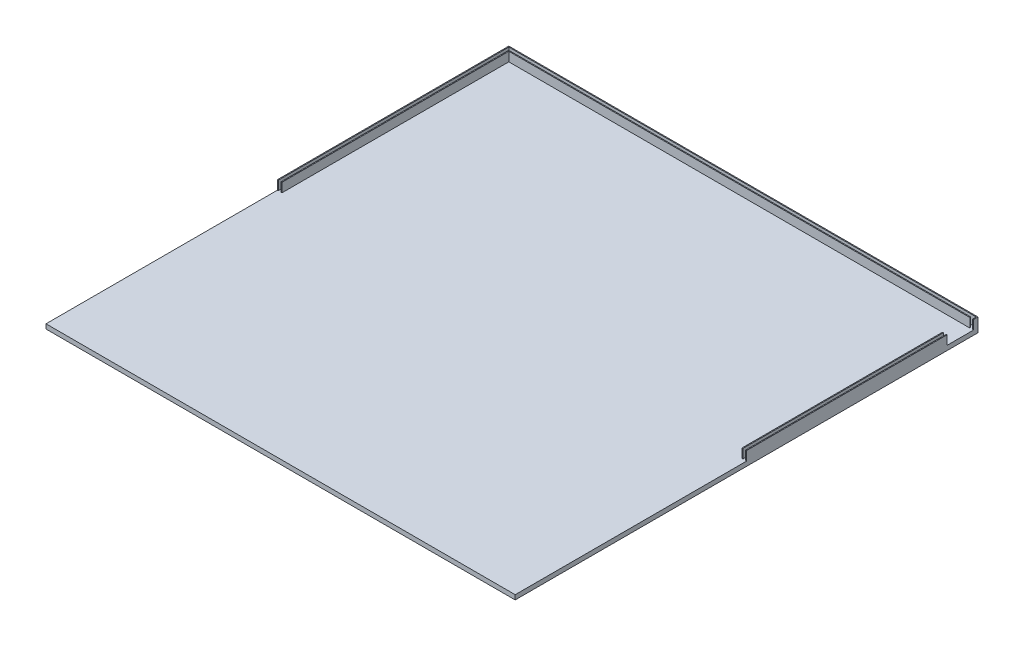
ISO-10303-21;
HEADER;
FILE_DESCRIPTION(('STEP AP214'),'2;1');
FILE_NAME('part.step','',(''),(''),'','','');
FILE_SCHEMA(('AUTOMOTIVE_DESIGN { 1 0 10303 214 1 1 1 1 }'));
ENDSEC;
DATA;
#1=APPLICATION_CONTEXT('core data for automotive mechanical design processes');
#2=APPLICATION_PROTOCOL_DEFINITION('international standard','automotive_design',2000,#1);
#3=PRODUCT_CONTEXT('',#1,'mechanical');
#4=PRODUCT('Part','Part','',(#3));
#5=PRODUCT_RELATED_PRODUCT_CATEGORY('part','',(#4));
#6=PRODUCT_DEFINITION_FORMATION('','',#4);
#7=PRODUCT_DEFINITION_CONTEXT('part definition',#1,'design');
#8=PRODUCT_DEFINITION('design','',#6,#7);
#9=PRODUCT_DEFINITION_SHAPE('','',#8);
#10=(LENGTH_UNIT() NAMED_UNIT(*) SI_UNIT(.MILLI.,.METRE.));
#11=(NAMED_UNIT(*) PLANE_ANGLE_UNIT() SI_UNIT($,.RADIAN.));
#12=(NAMED_UNIT(*) SI_UNIT($,.STERADIAN.) SOLID_ANGLE_UNIT());
#13=UNCERTAINTY_MEASURE_WITH_UNIT(LENGTH_MEASURE(1.E-05),#10,'distance_accuracy_value','');
#14=(GEOMETRIC_REPRESENTATION_CONTEXT(3) GLOBAL_UNCERTAINTY_ASSIGNED_CONTEXT((#13)) GLOBAL_UNIT_ASSIGNED_CONTEXT((#10,
#11,#12)) REPRESENTATION_CONTEXT('',''));
#15=CARTESIAN_POINT('',(0.,0.,0.));
#16=DIRECTION('',(0.,0.,1.));
#17=DIRECTION('',(1.,0.,0.));
#18=AXIS2_PLACEMENT_3D('',#15,#16,#17);
#19=CARTESIAN_POINT('',(0.,15.,0.));
#20=DIRECTION('',(0.,1.,0.));
#21=DIRECTION('',(0.,0.,1.));
#22=AXIS2_PLACEMENT_3D('',#19,#20,#21);
#23=PLANE('',#22);
#24=DIRECTION('',(-1.,0.,0.));
#25=VECTOR('',#24,1.);
#26=CARTESIAN_POINT('',(415.395426848687,15.,-66.0855947856733));
#27=LINE('',#26,#25);
#28=CARTESIAN_POINT('',(416.395426848687,15.,-66.0855947856733));
#29=VERTEX_POINT('',#28);
#30=CARTESIAN_POINT('',(415.395426848687,15.,-66.0855947856733));
#31=VERTEX_POINT('',#30);
#32=EDGE_CURVE('E206',#29,#31,#27,.T.);
#33=ORIENTED_EDGE('',*,*,#32,.F.);
#34=DIRECTION('',(0.,0.,-1.));
#35=VECTOR('',#34,1.);
#36=CARTESIAN_POINT('',(416.395426848687,15.,-71.0855947856733));
#37=LINE('',#36,#35);
#38=CARTESIAN_POINT('',(416.395426848687,15.,-71.0855947856733));
#39=VERTEX_POINT('',#38);
#40=EDGE_CURVE('E259',#29,#39,#37,.T.);
#41=ORIENTED_EDGE('',*,*,#40,.T.);
#42=DIRECTION('',(-1.,0.,0.));
#43=VECTOR('',#42,1.);
#44=CARTESIAN_POINT('',(-97.6045731513132,15.,-71.0855947856733));
#45=LINE('',#44,#43);
#46=CARTESIAN_POINT('',(-97.6045731513132,15.,-71.0855947856733));
#47=VERTEX_POINT('',#46);
#48=EDGE_CURVE('E286',#39,#47,#45,.T.);
#49=ORIENTED_EDGE('',*,*,#48,.T.);
#50=DIRECTION('',(0.,0.,1.));
#51=VECTOR('',#50,1.);
#52=CARTESIAN_POINT('',(-97.6045731513132,15.,-71.0855947856733));
#53=LINE('',#52,#51);
#54=CARTESIAN_POINT('',(-97.6045731513131,15.,182.414405214327));
#55=VERTEX_POINT('',#54);
#56=EDGE_CURVE('E276',#47,#55,#53,.T.);
#57=ORIENTED_EDGE('',*,*,#56,.T.);
#58=DIRECTION('',(1.,0.,0.));
#59=VECTOR('',#58,1.);
#60=CARTESIAN_POINT('',(-97.6045731513131,15.,182.414405214327));
#61=LINE('',#60,#59);
#62=CARTESIAN_POINT('',(-96.6045731513131,15.,182.414405214327));
#63=VERTEX_POINT('',#62);
#64=EDGE_CURVE('E280',#55,#63,#61,.T.);
#65=ORIENTED_EDGE('',*,*,#64,.T.);
#66=DIRECTION('',(0.,0.,1.));
#67=VECTOR('',#66,1.);
#68=CARTESIAN_POINT('',(-96.6045731513132,15.,-71.0855947856733));
#69=LINE('',#68,#67);
#70=CARTESIAN_POINT('',(-96.6045731513132,15.,-70.0855947856733));
#71=VERTEX_POINT('',#70);
#72=EDGE_CURVE('E245',#71,#63,#69,.T.);
#73=ORIENTED_EDGE('',*,*,#72,.F.);
#74=DIRECTION('',(-1.,0.,0.));
#75=VECTOR('',#74,1.);
#76=CARTESIAN_POINT('',(-96.6045731513132,15.,-70.0855947856733));
#77=LINE('',#76,#75);
#78=CARTESIAN_POINT('',(415.395426848687,15.,-70.0855947856733));
#79=VERTEX_POINT('',#78);
#80=EDGE_CURVE('E348',#79,#71,#77,.T.);
#81=ORIENTED_EDGE('',*,*,#80,.F.);
#82=DIRECTION('',(0.,0.,-1.));
#83=VECTOR('',#82,1.);
#84=CARTESIAN_POINT('',(415.395426848687,15.,-71.0855947856733));
#85=LINE('',#84,#83);
#86=EDGE_CURVE('E60',#31,#79,#85,.T.);
#87=ORIENTED_EDGE('',*,*,#86,.F.);
#88=EDGE_LOOP('',(#33,#41,#49,#57,#65,#73,#81,#87));
#89=FACE_BOUND('',#88,.T.);
#90=ADVANCED_FACE('F37',(#89),#23,.T.);
#91=CARTESIAN_POINT('',(415.395426848687,5.,-71.0855947856733));
#92=DIRECTION('',(1.,0.,0.));
#93=DIRECTION('',(0.,0.,-1.));
#94=AXIS2_PLACEMENT_3D('',#91,#92,#93);
#95=PLANE('',#94);
#96=DIRECTION('',(0.,0.,-1.));
#97=VECTOR('',#96,1.);
#98=CARTESIAN_POINT('',(415.395426848687,5.,-71.0855947856733));
#99=LINE('',#98,#97);
#100=CARTESIAN_POINT('',(415.395426848687,5.,-66.0855947856733));
#101=VERTEX_POINT('',#100);
#102=CARTESIAN_POINT('',(415.395426848687,5.,-70.0855947856733));
#103=VERTEX_POINT('',#102);
#104=EDGE_CURVE('E222',#101,#103,#99,.T.);
#105=ORIENTED_EDGE('',*,*,#104,.F.);
#106=DIRECTION('',(0.,1.,0.));
#107=VECTOR('',#106,1.);
#108=CARTESIAN_POINT('',(415.395426848687,5.,-66.0855947856733));
#109=LINE('',#108,#107);
#110=EDGE_CURVE('E382',#101,#31,#109,.T.);
#111=ORIENTED_EDGE('',*,*,#110,.T.);
#112=ORIENTED_EDGE('',*,*,#86,.T.);
#113=DIRECTION('',(0.,1.,0.));
#114=VECTOR('',#113,1.);
#115=CARTESIAN_POINT('',(415.395426848687,5.,-70.0855947856733));
#116=LINE('',#115,#114);
#117=EDGE_CURVE('E340',#103,#79,#116,.T.);
#118=ORIENTED_EDGE('',*,*,#117,.F.);
#119=EDGE_LOOP('',(#105,#111,#112,#118));
#120=FACE_BOUND('',#119,.T.);
#121=ADVANCED_FACE('F428',(#120),#95,.F.);
#122=CARTESIAN_POINT('',(412.395426848687,5.,-71.0855947856733));
#123=DIRECTION('',(-1.,0.,0.));
#124=DIRECTION('',(0.,0.,1.));
#125=AXIS2_PLACEMENT_3D('',#122,#123,#124);
#126=PLANE('',#125);
#127=DIRECTION('',(0.,0.,1.));
#128=VECTOR('',#127,1.);
#129=CARTESIAN_POINT('',(412.395426848687,15.,-71.0855947856733));
#130=LINE('',#129,#128);
#131=CARTESIAN_POINT('',(412.395426848687,15.,-67.0855947856733));
#132=VERTEX_POINT('',#131);
#133=CARTESIAN_POINT('',(412.395426848687,15.,-66.0855947856733));
#134=VERTEX_POINT('',#133);
#135=EDGE_CURVE('E226',#132,#134,#130,.T.);
#136=ORIENTED_EDGE('',*,*,#135,.T.);
#137=DIRECTION('',(0.,1.,0.));
#138=VECTOR('',#137,1.);
#139=CARTESIAN_POINT('',(412.395426848687,5.,-66.0855947856733));
#140=LINE('',#139,#138);
#141=CARTESIAN_POINT('',(412.395426848687,5.,-66.0855947856733));
#142=VERTEX_POINT('',#141);
#143=EDGE_CURVE('E372',#142,#134,#140,.T.);
#144=ORIENTED_EDGE('',*,*,#143,.F.);
#145=DIRECTION('',(0.,0.,1.));
#146=VECTOR('',#145,1.);
#147=CARTESIAN_POINT('',(412.395426848687,5.,-71.0855947856733));
#148=LINE('',#147,#146);
#149=CARTESIAN_POINT('',(412.395426848687,5.,-67.0855947856733));
#150=VERTEX_POINT('',#149);
#151=EDGE_CURVE('E224',#150,#142,#148,.T.);
#152=ORIENTED_EDGE('',*,*,#151,.F.);
#153=DIRECTION('',(0.,1.,0.));
#154=VECTOR('',#153,1.);
#155=CARTESIAN_POINT('',(412.395426848687,5.,-67.0855947856733));
#156=LINE('',#155,#154);
#157=EDGE_CURVE('E351',#150,#132,#156,.T.);
#158=ORIENTED_EDGE('',*,*,#157,.T.);
#159=EDGE_LOOP('',(#136,#144,#152,#158));
#160=FACE_BOUND('',#159,.T.);
#161=ADVANCED_FACE('F482',(#160),#126,.F.);
#162=DIRECTION('',(1.,0.,0.));
#163=VECTOR('',#162,1.);
#164=CARTESIAN_POINT('',(-97.6045731513132,15.,-66.0855947856733));
#165=LINE('',#164,#163);
#166=CARTESIAN_POINT('',(-92.6045731513131,15.,-66.0855947856733));
#167=VERTEX_POINT('',#166);
#168=EDGE_CURVE('E336',#167,#134,#165,.T.);
#169=ORIENTED_EDGE('',*,*,#168,.T.);
#170=ORIENTED_EDGE('',*,*,#135,.F.);
#171=DIRECTION('',(1.,0.,0.));
#172=VECTOR('',#171,1.);
#173=CARTESIAN_POINT('',(-96.6045731513132,15.,-67.0855947856733));
#174=LINE('',#173,#172);
#175=CARTESIAN_POINT('',(-93.6045731513131,15.,-67.0855947856733));
#176=VERTEX_POINT('',#175);
#177=EDGE_CURVE('E345',#176,#132,#174,.T.);
#178=ORIENTED_EDGE('',*,*,#177,.F.);
#179=DIRECTION('',(0.,0.,-1.));
#180=VECTOR('',#179,1.);
#181=CARTESIAN_POINT('',(-93.6045731513131,15.,-71.0855947856733));
#182=LINE('',#181,#180);
#183=CARTESIAN_POINT('',(-93.6045731513131,15.,182.414405214327));
#184=VERTEX_POINT('',#183);
#185=EDGE_CURVE('E239',#184,#176,#182,.T.);
#186=ORIENTED_EDGE('',*,*,#185,.F.);
#187=CARTESIAN_POINT('',(-92.6045731513131,15.,182.414405214327));
#188=VERTEX_POINT('',#187);
#189=EDGE_CURVE('E278',#184,#188,#61,.T.);
#190=ORIENTED_EDGE('',*,*,#189,.T.);
#191=DIRECTION('',(0.,0.,-1.));
#192=VECTOR('',#191,1.);
#193=CARTESIAN_POINT('',(-92.6045731513131,15.,-71.0855947856733));
#194=LINE('',#193,#192);
#195=EDGE_CURVE('E283',#188,#167,#194,.T.);
#196=ORIENTED_EDGE('',*,*,#195,.T.);
#197=EDGE_LOOP('',(#169,#170,#178,#186,#190,#196));
#198=FACE_BOUND('',#197,.T.);
#199=ADVANCED_FACE('F467',(#198),#23,.T.);
#200=CARTESIAN_POINT('',(0.,0.,0.));
#201=DIRECTION('',(0.,1.,0.));
#202=DIRECTION('',(0.,0.,1.));
#203=AXIS2_PLACEMENT_3D('',#200,#201,#202);
#204=PLANE('',#203);
#205=CARTESIAN_POINT('',(366.395426848687,0.,-21.0855947856733));
#206=DIRECTION('',(0.,1.,0.));
#207=DIRECTION('',(0.,0.,1.));
#208=AXIS2_PLACEMENT_3D('',#205,#206,#207);
#209=CIRCLE('',#208,15.);
#210=CARTESIAN_POINT('',(366.395426848687,0.,-6.08559478567331));
#211=VERTEX_POINT('',#210);
#212=EDGE_CURVE('E45',#211,#211,#209,.F.);
#213=ORIENTED_EDGE('',*,*,#212,.F.);
#214=EDGE_LOOP('',(#213));
#215=FACE_BOUND('',#214,.T.);
#216=CARTESIAN_POINT('',(-47.6045731513132,0.,385.914405214327));
#217=DIRECTION('',(0.,1.,0.));
#218=DIRECTION('',(0.,0.,1.));
#219=AXIS2_PLACEMENT_3D('',#216,#217,#218);
#220=CIRCLE('',#219,15.);
#221=CARTESIAN_POINT('',(-47.6045731513132,0.,400.914405214327));
#222=VERTEX_POINT('',#221);
#223=EDGE_CURVE('E301',#222,#222,#220,.F.);
#224=ORIENTED_EDGE('',*,*,#223,.F.);
#225=EDGE_LOOP('',(#224));
#226=FACE_BOUND('',#225,.T.);
#227=DIRECTION('',(0.,0.,-1.));
#228=VECTOR('',#227,1.);
#229=CARTESIAN_POINT('',(416.395426848687,0.,-71.0855947856733));
#230=LINE('',#229,#228);
#231=CARTESIAN_POINT('',(416.395426848687,0.,435.914405214327));
#232=VERTEX_POINT('',#231);
#233=CARTESIAN_POINT('',(416.395426848687,0.,-71.0855947856733));
#234=VERTEX_POINT('',#233);
#235=EDGE_CURVE('E309',#232,#234,#230,.T.);
#236=ORIENTED_EDGE('',*,*,#235,.F.);
#237=DIRECTION('',(1.,0.,0.));
#238=VECTOR('',#237,1.);
#239=CARTESIAN_POINT('',(-97.6045731513131,0.,435.914405214327));
#240=LINE('',#239,#238);
#241=CARTESIAN_POINT('',(-97.6045731513131,0.,435.914405214327));
#242=VERTEX_POINT('',#241);
#243=EDGE_CURVE('E437',#242,#232,#240,.T.);
#244=ORIENTED_EDGE('',*,*,#243,.F.);
#245=DIRECTION('',(0.,0.,1.));
#246=VECTOR('',#245,1.);
#247=CARTESIAN_POINT('',(-97.6045731513132,0.,-71.0855947856733));
#248=LINE('',#247,#246);
#249=CARTESIAN_POINT('',(-97.6045731513132,0.,-71.0855947856733));
#250=VERTEX_POINT('',#249);
#251=EDGE_CURVE('E443',#250,#242,#248,.T.);
#252=ORIENTED_EDGE('',*,*,#251,.F.);
#253=DIRECTION('',(-1.,0.,0.));
#254=VECTOR('',#253,1.);
#255=CARTESIAN_POINT('',(-97.6045731513132,0.,-71.0855947856733));
#256=LINE('',#255,#254);
#257=EDGE_CURVE('E315',#234,#250,#256,.T.);
#258=ORIENTED_EDGE('',*,*,#257,.F.);
#259=EDGE_LOOP('',(#236,#244,#252,#258));
#260=FACE_BOUND('',#259,.T.);
#261=CARTESIAN_POINT('',(366.395426848687,0.,385.914405214327));
#262=DIRECTION('',(0.,1.,0.));
#263=DIRECTION('',(0.,0.,1.));
#264=AXIS2_PLACEMENT_3D('',#261,#262,#263);
#265=CIRCLE('',#264,15.);
#266=CARTESIAN_POINT('',(366.395426848687,0.,400.914405214327));
#267=VERTEX_POINT('',#266);
#268=EDGE_CURVE('E889',#267,#267,#265,.F.);
#269=ORIENTED_EDGE('',*,*,#268,.F.);
#270=EDGE_LOOP('',(#269));
#271=FACE_BOUND('',#270,.T.);
#272=CARTESIAN_POINT('',(-47.6045731513131,0.,-21.0855947856733));
#273=DIRECTION('',(0.,1.,0.));
#274=DIRECTION('',(0.,0.,1.));
#275=AXIS2_PLACEMENT_3D('',#272,#273,#274);
#276=CIRCLE('',#275,15.);
#277=CARTESIAN_POINT('',(-47.6045731513131,0.,-6.08559478567333));
#278=VERTEX_POINT('',#277);
#279=EDGE_CURVE('E11',#278,#278,#276,.F.);
#280=ORIENTED_EDGE('',*,*,#279,.F.);
#281=EDGE_LOOP('',(#280));
#282=FACE_BOUND('',#281,.T.);
#283=ADVANCED_FACE('F454',(#215,#226,#260,#271,#282),#204,.F.);
#284=DIRECTION('',(1.,0.,0.));
#285=VECTOR('',#284,1.);
#286=CARTESIAN_POINT('',(415.395426848687,15.,-37.0855947856733));
#287=LINE('',#286,#285);
#288=CARTESIAN_POINT('',(415.395426848687,15.,-37.0855947856733));
#289=VERTEX_POINT('',#288);
#290=CARTESIAN_POINT('',(416.395426848687,15.,-37.0855947856733));
#291=VERTEX_POINT('',#290);
#292=EDGE_CURVE('E390',#289,#291,#287,.T.);
#293=ORIENTED_EDGE('',*,*,#292,.F.);
#294=CARTESIAN_POINT('',(415.395426848687,15.,182.414405214327));
#295=VERTEX_POINT('',#294);
#296=EDGE_CURVE('E214',#295,#289,#85,.T.);
#297=ORIENTED_EDGE('',*,*,#296,.F.);
#298=DIRECTION('',(1.,0.,0.));
#299=VECTOR('',#298,1.);
#300=CARTESIAN_POINT('',(416.395426848687,15.,182.414405214327));
#301=LINE('',#300,#299);
#302=CARTESIAN_POINT('',(416.395426848687,15.,182.414405214327));
#303=VERTEX_POINT('',#302);
#304=EDGE_CURVE('E261',#295,#303,#301,.T.);
#305=ORIENTED_EDGE('',*,*,#304,.T.);
#306=EDGE_CURVE('E255',#303,#291,#37,.T.);
#307=ORIENTED_EDGE('',*,*,#306,.T.);
#308=EDGE_LOOP('',(#293,#297,#305,#307));
#309=FACE_BOUND('',#308,.T.);
#310=ADVANCED_FACE('F463',(#309),#23,.T.);
#311=CARTESIAN_POINT('',(0.,5.,0.));
#312=DIRECTION('',(0.,1.,0.));
#313=DIRECTION('',(0.,0.,1.));
#314=AXIS2_PLACEMENT_3D('',#311,#312,#313);
#315=PLANE('',#314);
#316=DIRECTION('',(0.,0.,1.));
#317=VECTOR('',#316,1.);
#318=CARTESIAN_POINT('',(411.395426848687,5.,-71.0855947856733));
#319=LINE('',#318,#317);
#320=CARTESIAN_POINT('',(411.395426848687,5.,-37.0855947856733));
#321=VERTEX_POINT('',#320);
#322=CARTESIAN_POINT('',(411.395426848687,5.,182.414405214327));
#323=VERTEX_POINT('',#322);
#324=EDGE_CURVE('E252',#321,#323,#319,.T.);
#325=ORIENTED_EDGE('',*,*,#324,.F.);
#326=DIRECTION('',(1.,0.,0.));
#327=VECTOR('',#326,1.);
#328=CARTESIAN_POINT('',(411.395426848687,5.,-37.0855947856733));
#329=LINE('',#328,#327);
#330=CARTESIAN_POINT('',(412.395426848687,5.,-37.0855947856733));
#331=VERTEX_POINT('',#330);
#332=EDGE_CURVE('E376',#321,#331,#329,.T.);
#333=ORIENTED_EDGE('',*,*,#332,.T.);
#334=CARTESIAN_POINT('',(412.395426848687,5.,182.414405214327));
#335=VERTEX_POINT('',#334);
#336=EDGE_CURVE('E221',#331,#335,#148,.T.);
#337=ORIENTED_EDGE('',*,*,#336,.T.);
#338=DIRECTION('',(1.,0.,0.));
#339=VECTOR('',#338,1.);
#340=CARTESIAN_POINT('',(416.395426848687,5.,182.414405214327));
#341=LINE('',#340,#339);
#342=EDGE_CURVE('E267',#323,#335,#341,.T.);
#343=ORIENTED_EDGE('',*,*,#342,.F.);
#344=EDGE_LOOP('',(#325,#333,#337,#343));
#345=FACE_BOUND('',#344,.T.);
#346=DIRECTION('',(0.,0.,-1.));
#347=VECTOR('',#346,1.);
#348=CARTESIAN_POINT('',(-93.6045731513131,5.,-71.0855947856733));
#349=LINE('',#348,#347);
#350=CARTESIAN_POINT('',(-93.6045731513131,5.,182.414405214327));
#351=VERTEX_POINT('',#350);
#352=CARTESIAN_POINT('',(-93.6045731513131,5.,-67.0855947856733));
#353=VERTEX_POINT('',#352);
#354=EDGE_CURVE('E242',#351,#353,#349,.T.);
#355=ORIENTED_EDGE('',*,*,#354,.T.);
#356=DIRECTION('',(1.,0.,0.));
#357=VECTOR('',#356,1.);
#358=CARTESIAN_POINT('',(-96.6045731513132,5.,-67.0855947856733));
#359=LINE('',#358,#357);
#360=EDGE_CURVE('E343',#353,#150,#359,.T.);
#361=ORIENTED_EDGE('',*,*,#360,.T.);
#362=ORIENTED_EDGE('',*,*,#151,.T.);
#363=DIRECTION('',(1.,0.,0.));
#364=VECTOR('',#363,1.);
#365=CARTESIAN_POINT('',(-97.6045731513132,5.,-66.0855947856733));
#366=LINE('',#365,#364);
#367=CARTESIAN_POINT('',(-92.6045731513131,5.,-66.0855947856733));
#368=VERTEX_POINT('',#367);
#369=EDGE_CURVE('E331',#368,#142,#366,.T.);
#370=ORIENTED_EDGE('',*,*,#369,.F.);
#371=DIRECTION('',(0.,0.,-1.));
#372=VECTOR('',#371,1.);
#373=CARTESIAN_POINT('',(-92.6045731513131,5.,-71.0855947856733));
#374=LINE('',#373,#372);
#375=CARTESIAN_POINT('',(-92.6045731513131,5.,182.414405214327));
#376=VERTEX_POINT('',#375);
#377=EDGE_CURVE('E279',#376,#368,#374,.T.);
#378=ORIENTED_EDGE('',*,*,#377,.F.);
#379=DIRECTION('',(1.,0.,0.));
#380=VECTOR('',#379,1.);
#381=CARTESIAN_POINT('',(-97.6045731513131,5.,182.414405214327));
#382=LINE('',#381,#380);
#383=EDGE_CURVE('E275',#351,#376,#382,.T.);
#384=ORIENTED_EDGE('',*,*,#383,.F.);
#385=EDGE_LOOP('',(#355,#361,#362,#370,#378,#384));
#386=FACE_BOUND('',#385,.T.);
#387=CARTESIAN_POINT('',(415.395426848687,5.,182.414405214327));
#388=VERTEX_POINT('',#387);
#389=CARTESIAN_POINT('',(415.395426848687,5.,-37.0855947856733));
#390=VERTEX_POINT('',#389);
#391=EDGE_CURVE('E211',#388,#390,#99,.T.);
#392=ORIENTED_EDGE('',*,*,#391,.T.);
#393=DIRECTION('',(1.,0.,0.));
#394=VECTOR('',#393,1.);
#395=CARTESIAN_POINT('',(415.395426848687,5.,-37.0855947856733));
#396=LINE('',#395,#394);
#397=CARTESIAN_POINT('',(416.395426848687,5.,-37.0855947856733));
#398=VERTEX_POINT('',#397);
#399=EDGE_CURVE('E52',#390,#398,#396,.T.);
#400=ORIENTED_EDGE('',*,*,#399,.T.);
#401=DIRECTION('',(0.,0.,-1.));
#402=VECTOR('',#401,1.);
#403=CARTESIAN_POINT('',(416.395426848687,5.,-37.0855947856733));
#404=LINE('',#403,#402);
#405=CARTESIAN_POINT('',(416.395426848687,5.,-66.0855947856733));
#406=VERTEX_POINT('',#405);
#407=EDGE_CURVE('E205',#398,#406,#404,.T.);
#408=ORIENTED_EDGE('',*,*,#407,.T.);
#409=DIRECTION('',(-1.,0.,0.));
#410=VECTOR('',#409,1.);
#411=CARTESIAN_POINT('',(415.395426848687,5.,-66.0855947856733));
#412=LINE('',#411,#410);
#413=EDGE_CURVE('E215',#406,#101,#412,.T.);
#414=ORIENTED_EDGE('',*,*,#413,.T.);
#415=ORIENTED_EDGE('',*,*,#104,.T.);
#416=DIRECTION('',(-1.,0.,0.));
#417=VECTOR('',#416,1.);
#418=CARTESIAN_POINT('',(-96.6045731513132,5.,-70.0855947856733));
#419=LINE('',#418,#417);
#420=CARTESIAN_POINT('',(-96.6045731513132,5.,-70.0855947856733));
#421=VERTEX_POINT('',#420);
#422=EDGE_CURVE('E347',#103,#421,#419,.T.);
#423=ORIENTED_EDGE('',*,*,#422,.T.);
#424=DIRECTION('',(0.,0.,1.));
#425=VECTOR('',#424,1.);
#426=CARTESIAN_POINT('',(-96.6045731513132,5.,-71.0855947856733));
#427=LINE('',#426,#425);
#428=CARTESIAN_POINT('',(-96.6045731513131,5.,182.414405214327));
#429=VERTEX_POINT('',#428);
#430=EDGE_CURVE('E244',#421,#429,#427,.T.);
#431=ORIENTED_EDGE('',*,*,#430,.T.);
#432=CARTESIAN_POINT('',(-97.6045731513131,5.,182.414405214327));
#433=VERTEX_POINT('',#432);
#434=EDGE_CURVE('E296',#433,#429,#382,.T.);
#435=ORIENTED_EDGE('',*,*,#434,.F.);
#436=DIRECTION('',(0.,0.,1.));
#437=VECTOR('',#436,1.);
#438=CARTESIAN_POINT('',(-97.6045731513132,5.,-71.0855947856733));
#439=LINE('',#438,#437);
#440=CARTESIAN_POINT('',(-97.6045731513131,5.,435.914405214327));
#441=VERTEX_POINT('',#440);
#442=EDGE_CURVE('E429',#433,#441,#439,.T.);
#443=ORIENTED_EDGE('',*,*,#442,.T.);
#444=DIRECTION('',(1.,0.,0.));
#445=VECTOR('',#444,1.);
#446=CARTESIAN_POINT('',(-97.6045731513131,5.,435.914405214327));
#447=LINE('',#446,#445);
#448=CARTESIAN_POINT('',(416.395426848687,5.,435.914405214327));
#449=VERTEX_POINT('',#448);
#450=EDGE_CURVE('E433',#441,#449,#447,.T.);
#451=ORIENTED_EDGE('',*,*,#450,.T.);
#452=DIRECTION('',(0.,0.,-1.));
#453=VECTOR('',#452,1.);
#454=CARTESIAN_POINT('',(416.395426848687,5.,-71.0855947856733));
#455=LINE('',#454,#453);
#456=CARTESIAN_POINT('',(416.395426848687,5.,182.414405214327));
#457=VERTEX_POINT('',#456);
#458=EDGE_CURVE('E434',#449,#457,#455,.T.);
#459=ORIENTED_EDGE('',*,*,#458,.T.);
#460=EDGE_CURVE('E220',#388,#457,#341,.T.);
#461=ORIENTED_EDGE('',*,*,#460,.F.);
#462=EDGE_LOOP('',(#392,#400,#408,#414,#415,#423,#431,#435,#443,#451,#459,#461));
#463=FACE_BOUND('',#462,.T.);
#464=ADVANCED_FACE('F218',(#345,#386,#463),#315,.T.);
#465=CARTESIAN_POINT('',(-92.6045731513131,15.,-71.0855947856733));
#466=DIRECTION('',(-1.,0.,0.));
#467=DIRECTION('',(0.,0.,1.));
#468=AXIS2_PLACEMENT_3D('',#465,#466,#467);
#469=PLANE('',#468);
#470=DIRECTION('',(0.,-1.,0.));
#471=VECTOR('',#470,1.);
#472=CARTESIAN_POINT('',(-92.6045731513131,15.,-66.0855947856733));
#473=LINE('',#472,#471);
#474=EDGE_CURVE('E228',#167,#368,#473,.T.);
#475=ORIENTED_EDGE('',*,*,#474,.F.);
#476=ORIENTED_EDGE('',*,*,#195,.F.);
#477=DIRECTION('',(0.,-1.,0.));
#478=VECTOR('',#477,1.);
#479=CARTESIAN_POINT('',(-92.6045731513131,15.,182.414405214327));
#480=LINE('',#479,#478);
#481=EDGE_CURVE('E288',#188,#376,#480,.T.);
#482=ORIENTED_EDGE('',*,*,#481,.T.);
#483=ORIENTED_EDGE('',*,*,#377,.T.);
#484=EDGE_LOOP('',(#475,#476,#482,#483));
#485=FACE_BOUND('',#484,.T.);
#486=ADVANCED_FACE('F322',(#485),#469,.F.);
#487=CARTESIAN_POINT('',(411.395426848687,15.,-71.0855947856733));
#488=DIRECTION('',(1.,0.,0.));
#489=DIRECTION('',(0.,0.,-1.));
#490=AXIS2_PLACEMENT_3D('',#487,#488,#489);
#491=PLANE('',#490);
#492=DIRECTION('',(0.,0.,1.));
#493=VECTOR('',#492,1.);
#494=CARTESIAN_POINT('',(411.395426848687,15.,-71.0855947856733));
#495=LINE('',#494,#493);
#496=CARTESIAN_POINT('',(411.395426848687,15.,-37.0855947856733));
#497=VERTEX_POINT('',#496);
#498=CARTESIAN_POINT('',(411.395426848687,15.,182.414405214327));
#499=VERTEX_POINT('',#498);
#500=EDGE_CURVE('E258',#497,#499,#495,.T.);
#501=ORIENTED_EDGE('',*,*,#500,.F.);
#502=DIRECTION('',(0.,1.,0.));
#503=VECTOR('',#502,1.);
#504=CARTESIAN_POINT('',(411.395426848687,5.,-37.0855947856733));
#505=LINE('',#504,#503);
#506=EDGE_CURVE('E373',#321,#497,#505,.T.);
#507=ORIENTED_EDGE('',*,*,#506,.F.);
#508=ORIENTED_EDGE('',*,*,#324,.T.);
#509=DIRECTION('',(0.,-1.,0.));
#510=VECTOR('',#509,1.);
#511=CARTESIAN_POINT('',(411.395426848687,15.,182.414405214327));
#512=LINE('',#511,#510);
#513=EDGE_CURVE('E272',#499,#323,#512,.T.);
#514=ORIENTED_EDGE('',*,*,#513,.F.);
#515=EDGE_LOOP('',(#501,#507,#508,#514));
#516=FACE_BOUND('',#515,.T.);
#517=ADVANCED_FACE('F506',(#516),#491,.F.);
#518=CARTESIAN_POINT('',(-93.6045731513131,5.,-71.0855947856733));
#519=DIRECTION('',(1.,0.,0.));
#520=DIRECTION('',(0.,0.,-1.));
#521=AXIS2_PLACEMENT_3D('',#518,#519,#520);
#522=PLANE('',#521);
#523=ORIENTED_EDGE('',*,*,#185,.T.);
#524=DIRECTION('',(0.,1.,0.));
#525=VECTOR('',#524,1.);
#526=CARTESIAN_POINT('',(-93.6045731513131,5.,-67.0855947856733));
#527=LINE('',#526,#525);
#528=EDGE_CURVE('E357',#353,#176,#527,.T.);
#529=ORIENTED_EDGE('',*,*,#528,.F.);
#530=ORIENTED_EDGE('',*,*,#354,.F.);
#531=DIRECTION('',(0.,1.,0.));
#532=VECTOR('',#531,1.);
#533=CARTESIAN_POINT('',(-93.6045731513131,5.,182.414405214327));
#534=LINE('',#533,#532);
#535=EDGE_CURVE('E250',#351,#184,#534,.T.);
#536=ORIENTED_EDGE('',*,*,#535,.T.);
#537=EDGE_LOOP('',(#523,#529,#530,#536));
#538=FACE_BOUND('',#537,.T.);
#539=ADVANCED_FACE('F502',(#538),#522,.F.);
#540=CARTESIAN_POINT('',(-96.6045731513132,5.,-71.0855947856733));
#541=DIRECTION('',(-1.,0.,0.));
#542=DIRECTION('',(0.,0.,1.));
#543=AXIS2_PLACEMENT_3D('',#540,#541,#542);
#544=PLANE('',#543);
#545=ORIENTED_EDGE('',*,*,#430,.F.);
#546=DIRECTION('',(0.,1.,0.));
#547=VECTOR('',#546,1.);
#548=CARTESIAN_POINT('',(-96.6045731513132,5.,-70.0855947856733));
#549=LINE('',#548,#547);
#550=EDGE_CURVE('E337',#421,#71,#549,.T.);
#551=ORIENTED_EDGE('',*,*,#550,.T.);
#552=ORIENTED_EDGE('',*,*,#72,.T.);
#553=DIRECTION('',(0.,1.,0.));
#554=VECTOR('',#553,1.);
#555=CARTESIAN_POINT('',(-96.6045731513131,5.,182.414405214327));
#556=LINE('',#555,#554);
#557=EDGE_CURVE('E247',#429,#63,#556,.T.);
#558=ORIENTED_EDGE('',*,*,#557,.F.);
#559=EDGE_LOOP('',(#545,#551,#552,#558));
#560=FACE_BOUND('',#559,.T.);
#561=ADVANCED_FACE('F422',(#560),#544,.F.);
#562=ORIENTED_EDGE('',*,*,#296,.T.);
#563=DIRECTION('',(0.,1.,0.));
#564=VECTOR('',#563,1.);
#565=CARTESIAN_POINT('',(415.395426848687,5.,-37.0855947856733));
#566=LINE('',#565,#564);
#567=EDGE_CURVE('E200',#390,#289,#566,.T.);
#568=ORIENTED_EDGE('',*,*,#567,.F.);
#569=ORIENTED_EDGE('',*,*,#391,.F.);
#570=DIRECTION('',(0.,1.,0.));
#571=VECTOR('',#570,1.);
#572=CARTESIAN_POINT('',(415.395426848687,5.,182.414405214327));
#573=LINE('',#572,#571);
#574=EDGE_CURVE('E237',#388,#295,#573,.T.);
#575=ORIENTED_EDGE('',*,*,#574,.T.);
#576=EDGE_LOOP('',(#562,#568,#569,#575));
#577=FACE_BOUND('',#576,.T.);
#578=ADVANCED_FACE('F210',(#577),#95,.F.);
#579=ORIENTED_EDGE('',*,*,#336,.F.);
#580=DIRECTION('',(0.,1.,0.));
#581=VECTOR('',#580,1.);
#582=CARTESIAN_POINT('',(412.395426848687,5.,-37.0855947856733));
#583=LINE('',#582,#581);
#584=CARTESIAN_POINT('',(412.395426848687,15.,-37.0855947856733));
#585=VERTEX_POINT('',#584);
#586=EDGE_CURVE('E375',#331,#585,#583,.T.);
#587=ORIENTED_EDGE('',*,*,#586,.T.);
#588=CARTESIAN_POINT('',(412.395426848687,15.,182.414405214327));
#589=VERTEX_POINT('',#588);
#590=EDGE_CURVE('E234',#585,#589,#130,.T.);
#591=ORIENTED_EDGE('',*,*,#590,.T.);
#592=DIRECTION('',(0.,1.,0.));
#593=VECTOR('',#592,1.);
#594=CARTESIAN_POINT('',(412.395426848687,5.,182.414405214327));
#595=LINE('',#594,#593);
#596=EDGE_CURVE('E232',#335,#589,#595,.T.);
#597=ORIENTED_EDGE('',*,*,#596,.F.);
#598=EDGE_LOOP('',(#579,#587,#591,#597));
#599=FACE_BOUND('',#598,.T.);
#600=ADVANCED_FACE('F494',(#599),#126,.F.);
#601=CARTESIAN_POINT('',(416.395426848687,15.,182.414405214327));
#602=DIRECTION('',(0.,0.,-1.));
#603=DIRECTION('',(-1.,0.,0.));
#604=AXIS2_PLACEMENT_3D('',#601,#602,#603);
#605=PLANE('',#604);
#606=ORIENTED_EDGE('',*,*,#304,.F.);
#607=ORIENTED_EDGE('',*,*,#574,.F.);
#608=ORIENTED_EDGE('',*,*,#460,.T.);
#609=DIRECTION('',(0.,-1.,0.));
#610=VECTOR('',#609,1.);
#611=CARTESIAN_POINT('',(416.395426848687,15.,182.414405214327));
#612=LINE('',#611,#610);
#613=EDGE_CURVE('E265',#303,#457,#612,.T.);
#614=ORIENTED_EDGE('',*,*,#613,.F.);
#615=EDGE_LOOP('',(#606,#607,#608,#614));
#616=FACE_BOUND('',#615,.T.);
#617=ADVANCED_FACE('F461',(#616),#605,.F.);
#618=CARTESIAN_POINT('',(-97.6045731513131,15.,182.414405214327));
#619=DIRECTION('',(0.,0.,-1.));
#620=DIRECTION('',(-1.,0.,0.));
#621=AXIS2_PLACEMENT_3D('',#618,#619,#620);
#622=PLANE('',#621);
#623=ORIENTED_EDGE('',*,*,#189,.F.);
#624=ORIENTED_EDGE('',*,*,#535,.F.);
#625=ORIENTED_EDGE('',*,*,#383,.T.);
#626=ORIENTED_EDGE('',*,*,#481,.F.);
#627=EDGE_LOOP('',(#623,#624,#625,#626));
#628=FACE_BOUND('',#627,.T.);
#629=ADVANCED_FACE('F326',(#628),#622,.F.);
#630=CARTESIAN_POINT('',(416.395426848687,5.,-71.0855947856733));
#631=DIRECTION('',(-1.,0.,0.));
#632=DIRECTION('',(0.,0.,1.));
#633=AXIS2_PLACEMENT_3D('',#630,#631,#632);
#634=PLANE('',#633);
#635=ORIENTED_EDGE('',*,*,#40,.F.);
#636=DIRECTION('',(0.,1.,0.));
#637=VECTOR('',#636,1.);
#638=CARTESIAN_POINT('',(416.395426848687,5.,-66.0855947856733));
#639=LINE('',#638,#637);
#640=EDGE_CURVE('E386',#406,#29,#639,.T.);
#641=ORIENTED_EDGE('',*,*,#640,.F.);
#642=ORIENTED_EDGE('',*,*,#407,.F.);
#643=DIRECTION('',(0.,1.,0.));
#644=VECTOR('',#643,1.);
#645=CARTESIAN_POINT('',(416.395426848687,5.,-37.0855947856733));
#646=LINE('',#645,#644);
#647=EDGE_CURVE('E203',#398,#291,#646,.T.);
#648=ORIENTED_EDGE('',*,*,#647,.T.);
#649=ORIENTED_EDGE('',*,*,#306,.F.);
#650=ORIENTED_EDGE('',*,*,#613,.T.);
#651=ORIENTED_EDGE('',*,*,#458,.F.);
#652=DIRECTION('',(0.,-1.,0.));
#653=VECTOR('',#652,1.);
#654=CARTESIAN_POINT('',(416.395426848687,5.,435.914405214327));
#655=LINE('',#654,#653);
#656=EDGE_CURVE('E435',#449,#232,#655,.T.);
#657=ORIENTED_EDGE('',*,*,#656,.T.);
#658=ORIENTED_EDGE('',*,*,#235,.T.);
#659=DIRECTION('',(0.,-1.,0.));
#660=VECTOR('',#659,1.);
#661=CARTESIAN_POINT('',(416.395426848687,5.,-71.0855947856733));
#662=LINE('',#661,#660);
#663=EDGE_CURVE('E403',#39,#234,#662,.T.);
#664=ORIENTED_EDGE('',*,*,#663,.F.);
#665=EDGE_LOOP('',(#635,#641,#642,#648,#649,#650,#651,#657,#658,#664));
#666=FACE_BOUND('',#665,.T.);
#667=ADVANCED_FACE('F39',(#666),#634,.F.);
#668=CARTESIAN_POINT('',(-97.6045731513132,5.,-71.0855947856733));
#669=DIRECTION('',(0.,0.,1.));
#670=DIRECTION('',(1.,0.,0.));
#671=AXIS2_PLACEMENT_3D('',#668,#669,#670);
#672=PLANE('',#671);
#673=DIRECTION('',(0.,-1.,0.));
#674=VECTOR('',#673,1.);
#675=CARTESIAN_POINT('',(-97.6045731513132,5.,-71.0855947856733));
#676=LINE('',#675,#674);
#677=EDGE_CURVE('E411',#47,#250,#676,.T.);
#678=ORIENTED_EDGE('',*,*,#677,.F.);
#679=ORIENTED_EDGE('',*,*,#48,.F.);
#680=ORIENTED_EDGE('',*,*,#663,.T.);
#681=ORIENTED_EDGE('',*,*,#257,.T.);
#682=EDGE_LOOP('',(#678,#679,#680,#681));
#683=FACE_BOUND('',#682,.T.);
#684=ADVANCED_FACE('F408',(#683),#672,.F.);
#685=CARTESIAN_POINT('',(-97.6045731513132,5.,-71.0855947856733));
#686=DIRECTION('',(1.,0.,0.));
#687=DIRECTION('',(0.,0.,-1.));
#688=AXIS2_PLACEMENT_3D('',#685,#686,#687);
#689=PLANE('',#688);
#690=DIRECTION('',(0.,-1.,0.));
#691=VECTOR('',#690,1.);
#692=CARTESIAN_POINT('',(-97.6045731513131,15.,182.414405214327));
#693=LINE('',#692,#691);
#694=EDGE_CURVE('E306',#55,#433,#693,.T.);
#695=ORIENTED_EDGE('',*,*,#694,.F.);
#696=ORIENTED_EDGE('',*,*,#56,.F.);
#697=ORIENTED_EDGE('',*,*,#677,.T.);
#698=ORIENTED_EDGE('',*,*,#251,.T.);
#699=DIRECTION('',(0.,-1.,0.));
#700=VECTOR('',#699,1.);
#701=CARTESIAN_POINT('',(-97.6045731513131,5.,435.914405214327));
#702=LINE('',#701,#700);
#703=EDGE_CURVE('E415',#441,#242,#702,.T.);
#704=ORIENTED_EDGE('',*,*,#703,.F.);
#705=ORIENTED_EDGE('',*,*,#442,.F.);
#706=EDGE_LOOP('',(#695,#696,#697,#698,#704,#705));
#707=FACE_BOUND('',#706,.T.);
#708=ADVANCED_FACE('F417',(#707),#689,.F.);
#709=CARTESIAN_POINT('',(-97.6045731513131,5.,435.914405214327));
#710=DIRECTION('',(0.,0.,-1.));
#711=DIRECTION('',(-1.,0.,0.));
#712=AXIS2_PLACEMENT_3D('',#709,#710,#711);
#713=PLANE('',#712);
#714=ORIENTED_EDGE('',*,*,#243,.T.);
#715=ORIENTED_EDGE('',*,*,#656,.F.);
#716=ORIENTED_EDGE('',*,*,#450,.F.);
#717=ORIENTED_EDGE('',*,*,#703,.T.);
#718=EDGE_LOOP('',(#714,#715,#716,#717));
#719=FACE_BOUND('',#718,.T.);
#720=ADVANCED_FACE('F450',(#719),#713,.F.);
#721=ORIENTED_EDGE('',*,*,#434,.T.);
#722=ORIENTED_EDGE('',*,*,#557,.T.);
#723=ORIENTED_EDGE('',*,*,#64,.F.);
#724=ORIENTED_EDGE('',*,*,#694,.T.);
#725=EDGE_LOOP('',(#721,#722,#723,#724));
#726=FACE_BOUND('',#725,.T.);
#727=ADVANCED_FACE('F419',(#726),#622,.F.);
#728=DIRECTION('',(1.,0.,0.));
#729=VECTOR('',#728,1.);
#730=CARTESIAN_POINT('',(411.395426848687,15.,-37.0855947856733));
#731=LINE('',#730,#729);
#732=EDGE_CURVE('E380',#497,#585,#731,.T.);
#733=ORIENTED_EDGE('',*,*,#732,.F.);
#734=ORIENTED_EDGE('',*,*,#500,.T.);
#735=EDGE_CURVE('E262',#499,#589,#301,.T.);
#736=ORIENTED_EDGE('',*,*,#735,.T.);
#737=ORIENTED_EDGE('',*,*,#590,.F.);
#738=EDGE_LOOP('',(#733,#734,#736,#737));
#739=FACE_BOUND('',#738,.T.);
#740=ADVANCED_FACE('F466',(#739),#23,.T.);
#741=ORIENTED_EDGE('',*,*,#342,.T.);
#742=ORIENTED_EDGE('',*,*,#596,.T.);
#743=ORIENTED_EDGE('',*,*,#735,.F.);
#744=ORIENTED_EDGE('',*,*,#513,.T.);
#745=EDGE_LOOP('',(#741,#742,#743,#744));
#746=FACE_BOUND('',#745,.T.);
#747=ADVANCED_FACE('F479',(#746),#605,.F.);
#748=CARTESIAN_POINT('',(-97.6045731513132,15.,-66.0855947856733));
#749=DIRECTION('',(0.,0.,-1.));
#750=DIRECTION('',(-1.,0.,0.));
#751=AXIS2_PLACEMENT_3D('',#748,#749,#750);
#752=PLANE('',#751);
#753=ORIENTED_EDGE('',*,*,#168,.F.);
#754=ORIENTED_EDGE('',*,*,#474,.T.);
#755=ORIENTED_EDGE('',*,*,#369,.T.);
#756=ORIENTED_EDGE('',*,*,#143,.T.);
#757=EDGE_LOOP('',(#753,#754,#755,#756));
#758=FACE_BOUND('',#757,.T.);
#759=ADVANCED_FACE('F511',(#758),#752,.F.);
#760=CARTESIAN_POINT('',(-96.6045731513132,5.,-67.0855947856733));
#761=DIRECTION('',(0.,0.,1.));
#762=DIRECTION('',(1.,0.,0.));
#763=AXIS2_PLACEMENT_3D('',#760,#761,#762);
#764=PLANE('',#763);
#765=ORIENTED_EDGE('',*,*,#360,.F.);
#766=ORIENTED_EDGE('',*,*,#528,.T.);
#767=ORIENTED_EDGE('',*,*,#177,.T.);
#768=ORIENTED_EDGE('',*,*,#157,.F.);
#769=EDGE_LOOP('',(#765,#766,#767,#768));
#770=FACE_BOUND('',#769,.T.);
#771=ADVANCED_FACE('F570',(#770),#764,.F.);
#772=CARTESIAN_POINT('',(-96.6045731513132,5.,-70.0855947856733));
#773=DIRECTION('',(0.,0.,-1.));
#774=DIRECTION('',(-1.,0.,0.));
#775=AXIS2_PLACEMENT_3D('',#772,#773,#774);
#776=PLANE('',#775);
#777=ORIENTED_EDGE('',*,*,#80,.T.);
#778=ORIENTED_EDGE('',*,*,#550,.F.);
#779=ORIENTED_EDGE('',*,*,#422,.F.);
#780=ORIENTED_EDGE('',*,*,#117,.T.);
#781=EDGE_LOOP('',(#777,#778,#779,#780));
#782=FACE_BOUND('',#781,.T.);
#783=ADVANCED_FACE('F426',(#782),#776,.F.);
#784=CARTESIAN_POINT('',(-47.6045731513132,-10.,385.914405214327));
#785=DIRECTION('',(0.,1.,0.));
#786=DIRECTION('',(0.,0.,1.));
#787=AXIS2_PLACEMENT_3D('',#784,#785,#786);
#788=CYLINDRICAL_SURFACE('',#787,15.);
#789=CARTESIAN_POINT('',(-47.6045731513132,-10.,385.914405214327));
#790=DIRECTION('',(0.,-1.,0.));
#791=DIRECTION('',(0.,0.,-1.));
#792=AXIS2_PLACEMENT_3D('',#789,#790,#791);
#793=CIRCLE('',#792,15.);
#794=CARTESIAN_POINT('',(-47.6045731513132,-10.,370.914405214327));
#795=VERTEX_POINT('',#794);
#796=EDGE_CURVE('E360',#795,#795,#793,.T.);
#797=ORIENTED_EDGE('',*,*,#796,.F.);
#798=EDGE_LOOP('',(#797));
#799=FACE_BOUND('',#798,.T.);
#800=ORIENTED_EDGE('',*,*,#223,.T.);
#801=EDGE_LOOP('',(#800));
#802=FACE_BOUND('',#801,.T.);
#803=ADVANCED_FACE('F565',(#799,#802),#788,.T.);
#804=CARTESIAN_POINT('',(-47.6045731513132,-10.,385.914405214327));
#805=DIRECTION('',(0.,-1.,0.));
#806=DIRECTION('',(0.,0.,-1.));
#807=AXIS2_PLACEMENT_3D('',#804,#805,#806);
#808=PLANE('',#807);
#809=ORIENTED_EDGE('',*,*,#796,.T.);
#810=EDGE_LOOP('',(#809));
#811=FACE_BOUND('',#810,.T.);
#812=ADVANCED_FACE('F561',(#811),#808,.T.);
#813=CARTESIAN_POINT('',(366.395426848687,-10.,385.914405214327));
#814=DIRECTION('',(0.,1.,0.));
#815=DIRECTION('',(0.,0.,1.));
#816=AXIS2_PLACEMENT_3D('',#813,#814,#815);
#817=CYLINDRICAL_SURFACE('',#816,15.);
#818=CARTESIAN_POINT('',(366.395426848687,-10.,385.914405214327));
#819=DIRECTION('',(0.,-1.,0.));
#820=DIRECTION('',(0.,0.,-1.));
#821=AXIS2_PLACEMENT_3D('',#818,#819,#820);
#822=CIRCLE('',#821,15.);
#823=CARTESIAN_POINT('',(366.395426848687,-10.,370.914405214327));
#824=VERTEX_POINT('',#823);
#825=EDGE_CURVE('E363',#824,#824,#822,.T.);
#826=ORIENTED_EDGE('',*,*,#825,.F.);
#827=EDGE_LOOP('',(#826));
#828=FACE_BOUND('',#827,.T.);
#829=ORIENTED_EDGE('',*,*,#268,.T.);
#830=EDGE_LOOP('',(#829));
#831=FACE_BOUND('',#830,.T.);
#832=ADVANCED_FACE('F557',(#828,#831),#817,.T.);
#833=CARTESIAN_POINT('',(366.395426848687,-10.,385.914405214327));
#834=DIRECTION('',(0.,-1.,0.));
#835=DIRECTION('',(0.,0.,-1.));
#836=AXIS2_PLACEMENT_3D('',#833,#834,#835);
#837=PLANE('',#836);
#838=ORIENTED_EDGE('',*,*,#825,.T.);
#839=EDGE_LOOP('',(#838));
#840=FACE_BOUND('',#839,.T.);
#841=ADVANCED_FACE('F553',(#840),#837,.T.);
#842=CARTESIAN_POINT('',(366.395426848687,-10.,-21.0855947856733));
#843=DIRECTION('',(0.,1.,0.));
#844=DIRECTION('',(0.,0.,1.));
#845=AXIS2_PLACEMENT_3D('',#842,#843,#844);
#846=CYLINDRICAL_SURFACE('',#845,15.);
#847=CARTESIAN_POINT('',(366.395426848687,-10.,-21.0855947856733));
#848=DIRECTION('',(0.,-1.,0.));
#849=DIRECTION('',(0.,0.,-1.));
#850=AXIS2_PLACEMENT_3D('',#847,#848,#849);
#851=CIRCLE('',#850,15.);
#852=CARTESIAN_POINT('',(366.395426848687,-10.,-36.0855947856734));
#853=VERTEX_POINT('',#852);
#854=EDGE_CURVE('E366',#853,#853,#851,.T.);
#855=ORIENTED_EDGE('',*,*,#854,.F.);
#856=EDGE_LOOP('',(#855));
#857=FACE_BOUND('',#856,.T.);
#858=ORIENTED_EDGE('',*,*,#212,.T.);
#859=EDGE_LOOP('',(#858));
#860=FACE_BOUND('',#859,.T.);
#861=ADVANCED_FACE('F549',(#857,#860),#846,.T.);
#862=CARTESIAN_POINT('',(366.395426848687,-10.,-21.0855947856733));
#863=DIRECTION('',(0.,-1.,0.));
#864=DIRECTION('',(0.,0.,-1.));
#865=AXIS2_PLACEMENT_3D('',#862,#863,#864);
#866=PLANE('',#865);
#867=ORIENTED_EDGE('',*,*,#854,.T.);
#868=EDGE_LOOP('',(#867));
#869=FACE_BOUND('',#868,.T.);
#870=ADVANCED_FACE('F545',(#869),#866,.T.);
#871=CARTESIAN_POINT('',(-47.6045731513131,-10.,-21.0855947856733));
#872=DIRECTION('',(0.,1.,0.));
#873=DIRECTION('',(0.,0.,1.));
#874=AXIS2_PLACEMENT_3D('',#871,#872,#873);
#875=CYLINDRICAL_SURFACE('',#874,15.);
#876=CARTESIAN_POINT('',(-47.6045731513131,-10.,-21.0855947856733));
#877=DIRECTION('',(0.,-1.,0.));
#878=DIRECTION('',(0.,0.,-1.));
#879=AXIS2_PLACEMENT_3D('',#876,#877,#878);
#880=CIRCLE('',#879,15.);
#881=CARTESIAN_POINT('',(-47.6045731513131,-10.,-36.0855947856733));
#882=VERTEX_POINT('',#881);
#883=EDGE_CURVE('E369',#882,#882,#880,.T.);
#884=ORIENTED_EDGE('',*,*,#883,.F.);
#885=EDGE_LOOP('',(#884));
#886=FACE_BOUND('',#885,.T.);
#887=ORIENTED_EDGE('',*,*,#279,.T.);
#888=EDGE_LOOP('',(#887));
#889=FACE_BOUND('',#888,.T.);
#890=ADVANCED_FACE('F538',(#886,#889),#875,.T.);
#891=CARTESIAN_POINT('',(-47.6045731513131,-10.,-21.0855947856733));
#892=DIRECTION('',(0.,-1.,0.));
#893=DIRECTION('',(0.,0.,-1.));
#894=AXIS2_PLACEMENT_3D('',#891,#892,#893);
#895=PLANE('',#894);
#896=ORIENTED_EDGE('',*,*,#883,.T.);
#897=EDGE_LOOP('',(#896));
#898=FACE_BOUND('',#897,.T.);
#899=ADVANCED_FACE('F531',(#898),#895,.T.);
#900=CARTESIAN_POINT('',(411.395426848687,5.,-37.0855947856733));
#901=DIRECTION('',(0.,0.,1.));
#902=DIRECTION('',(1.,0.,0.));
#903=AXIS2_PLACEMENT_3D('',#900,#901,#902);
#904=PLANE('',#903);
#905=ORIENTED_EDGE('',*,*,#732,.T.);
#906=ORIENTED_EDGE('',*,*,#586,.F.);
#907=ORIENTED_EDGE('',*,*,#332,.F.);
#908=ORIENTED_EDGE('',*,*,#506,.T.);
#909=EDGE_LOOP('',(#905,#906,#907,#908));
#910=FACE_BOUND('',#909,.T.);
#911=ADVANCED_FACE('F526',(#910),#904,.F.);
#912=CARTESIAN_POINT('',(415.395426848687,5.,-66.0855947856733));
#913=DIRECTION('',(0.,0.,-1.));
#914=DIRECTION('',(-1.,0.,0.));
#915=AXIS2_PLACEMENT_3D('',#912,#913,#914);
#916=PLANE('',#915);
#917=ORIENTED_EDGE('',*,*,#32,.T.);
#918=ORIENTED_EDGE('',*,*,#110,.F.);
#919=ORIENTED_EDGE('',*,*,#413,.F.);
#920=ORIENTED_EDGE('',*,*,#640,.T.);
#921=EDGE_LOOP('',(#917,#918,#919,#920));
#922=FACE_BOUND('',#921,.T.);
#923=ADVANCED_FACE('F399',(#922),#916,.F.);
#924=CARTESIAN_POINT('',(415.395426848687,5.,-37.0855947856733));
#925=DIRECTION('',(0.,0.,1.));
#926=DIRECTION('',(1.,0.,0.));
#927=AXIS2_PLACEMENT_3D('',#924,#925,#926);
#928=PLANE('',#927);
#929=ORIENTED_EDGE('',*,*,#292,.T.);
#930=ORIENTED_EDGE('',*,*,#647,.F.);
#931=ORIENTED_EDGE('',*,*,#399,.F.);
#932=ORIENTED_EDGE('',*,*,#567,.T.);
#933=EDGE_LOOP('',(#929,#930,#931,#932));
#934=FACE_BOUND('',#933,.T.);
#935=ADVANCED_FACE('F199',(#934),#928,.F.);
#936=CLOSED_SHELL('',(#90,#121,#161,#199,#283,#310,#464,#486,#517,#539,#561,#578,#600,#617,#629,
#667,#684,#708,#720,#727,#740,#747,#759,#771,#783,#803,#812,#832,#841,#861,#870,#890,#899,#911,
#923,#935));
#937=MANIFOLD_SOLID_BREP('B2',#936);
#938=ADVANCED_BREP_SHAPE_REPRESENTATION('',(#18,#937),#14);
#939=SHAPE_DEFINITION_REPRESENTATION(#9,#938);
ENDSEC;
END-ISO-10303-21;
